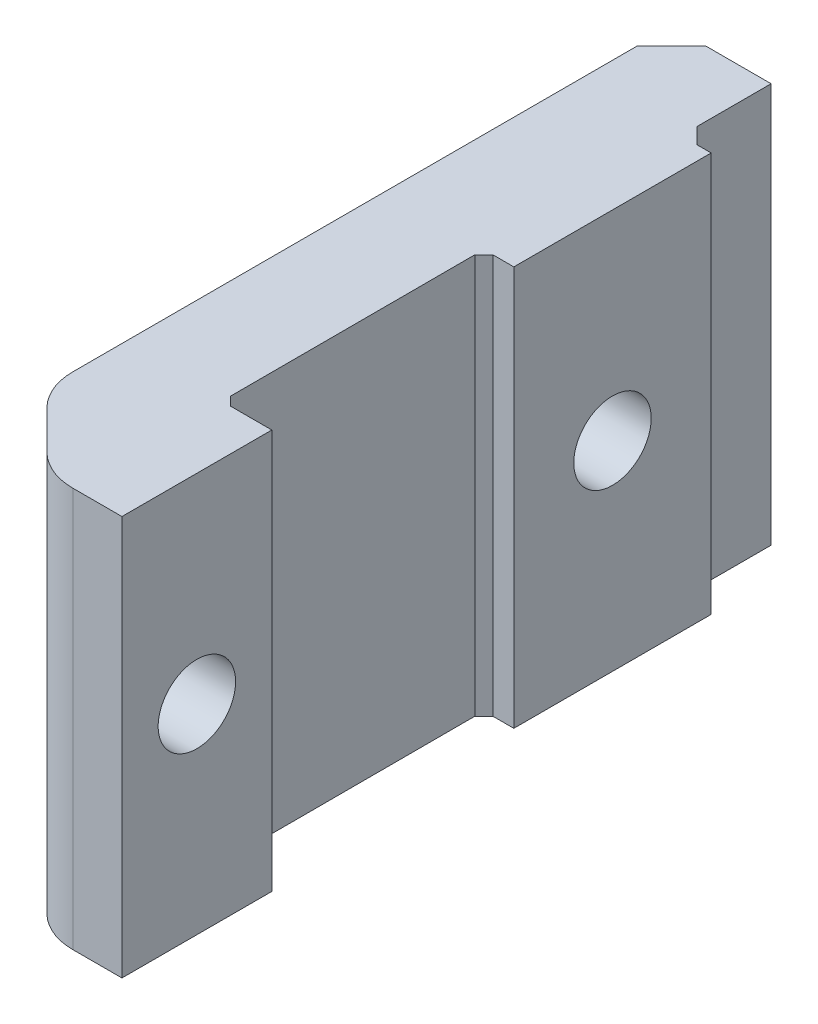
ISO-10303-21;
HEADER;
FILE_DESCRIPTION(('STEP AP214'),'2;1');
FILE_NAME('part.step','',(''),(''),'','','');
FILE_SCHEMA(('AUTOMOTIVE_DESIGN { 1 0 10303 214 1 1 1 1 }'));
ENDSEC;
DATA;
#1=APPLICATION_CONTEXT('core data for automotive mechanical design processes');
#2=APPLICATION_PROTOCOL_DEFINITION('international standard','automotive_design',2000,#1);
#3=PRODUCT_CONTEXT('',#1,'mechanical');
#4=PRODUCT('Part','Part','',(#3));
#5=PRODUCT_RELATED_PRODUCT_CATEGORY('part','',(#4));
#6=PRODUCT_DEFINITION_FORMATION('','',#4);
#7=PRODUCT_DEFINITION_CONTEXT('part definition',#1,'design');
#8=PRODUCT_DEFINITION('design','',#6,#7);
#9=PRODUCT_DEFINITION_SHAPE('','',#8);
#10=(LENGTH_UNIT() NAMED_UNIT(*) SI_UNIT(.MILLI.,.METRE.));
#11=(NAMED_UNIT(*) PLANE_ANGLE_UNIT() SI_UNIT($,.RADIAN.));
#12=(NAMED_UNIT(*) SI_UNIT($,.STERADIAN.) SOLID_ANGLE_UNIT());
#13=UNCERTAINTY_MEASURE_WITH_UNIT(LENGTH_MEASURE(1.E-05),#10,'distance_accuracy_value','');
#14=(GEOMETRIC_REPRESENTATION_CONTEXT(3) GLOBAL_UNCERTAINTY_ASSIGNED_CONTEXT((#13)) GLOBAL_UNIT_ASSIGNED_CONTEXT((#10,
#11,#12)) REPRESENTATION_CONTEXT('',''));
#15=CARTESIAN_POINT('',(0.,0.,0.));
#16=DIRECTION('',(0.,0.,1.));
#17=DIRECTION('',(1.,0.,0.));
#18=AXIS2_PLACEMENT_3D('',#15,#16,#17);
#19=CARTESIAN_POINT('',(-0.17686424474188,16.,3.99697087418199));
#20=DIRECTION('',(0.,-1.,0.));
#21=DIRECTION('',(0.,0.,-1.));
#22=AXIS2_PLACEMENT_3D('',#19,#20,#21);
#23=CYLINDRICAL_SURFACE('',#22,2.5);
#24=CARTESIAN_POINT('',(-2.67686424474188,6.84260296911639,3.99697087418198));
#25=CARTESIAN_POINT('',(-2.67686427610653,6.81660876371672,4.02615143134747));
#26=CARTESIAN_POINT('',(-2.67635253738409,6.79172903577268,4.05630654230294));
#27=CARTESIAN_POINT('',(-2.6741077573834,6.74432875148111,4.11838716476212));
#28=CARTESIAN_POINT('',(-2.67237435533673,6.72180889428229,4.15031319666867));
#29=CARTESIAN_POINT('',(-2.66504878235727,6.65803785912421,4.24840468920199));
#30=CARTESIAN_POINT('',(-2.65733182281447,6.62053670558533,4.31692688150311));
#31=CARTESIAN_POINT('',(-2.63501899545772,6.55648783693852,4.45804592967341));
#32=CARTESIAN_POINT('',(-2.620406159672,6.52996744493575,4.53065244510283));
#33=CARTESIAN_POINT('',(-2.58375461658301,6.48832135402202,4.67708775164324));
#34=CARTESIAN_POINT('',(-2.56173001823432,6.473174180874,4.75091396892161));
#35=CARTESIAN_POINT('',(-2.51094091923655,6.4539541686675,4.89577843485313));
#36=CARTESIAN_POINT('',(-2.48233559362208,6.44964470518506,4.9668422726878));
#37=CARTESIAN_POINT('',(-2.41861781582076,6.4504027173944,5.10622083257924));
#38=CARTESIAN_POINT('',(-2.38348141528112,6.45550534078939,5.17452427276868));
#39=CARTESIAN_POINT('',(-2.31726645703847,6.471496560265,5.29000177431587));
#40=CARTESIAN_POINT('',(-2.28741002219156,6.48059486754875,5.33814981628589));
#41=CARTESIAN_POINT('',(-2.22493832074662,6.50274474602274,5.43173878188784));
#42=CARTESIAN_POINT('',(-2.19232017194963,6.51580048487568,5.47717679085368));
#43=CARTESIAN_POINT('',(-2.1249581848118,6.54519305233081,5.56475980328549));
#44=CARTESIAN_POINT('',(-2.09023105628415,6.56150596302932,5.60692586907717));
#45=CARTESIAN_POINT('',(-2.01882983048771,6.59693105409345,5.68814880419962));
#46=CARTESIAN_POINT('',(-1.9821604062117,6.61603669448427,5.72721261720005));
#47=CARTESIAN_POINT('',(-1.94463119770824,6.63630875431511,5.76473782714836));
#48=B_SPLINE_CURVE_WITH_KNOTS('',3,(#24,#25,#26,#27,#28,#29,#30,#31,#32,#33,#34,#35,#36,#37,#38,
#39,#40,#41,#42,#43,#44,#45,#46,#47),.UNSPECIFIED.,.F.,.F.,(4,2,2,2,2,2,2,2,2,2,2,4),(0.,
0.117176915017423,0.23438844796454,0.468639716091678,0.70347041178757,0.937856591325261,
1.16707906126658,1.39715925375491,1.56903399994687,1.74109038400991,1.91192695332732,
2.08236968567321),.UNSPECIFIED.);
#49=CARTESIAN_POINT('',(-2.67686424474188,6.84260296911639,3.99697087418197));
#50=VERTEX_POINT('',#49);
#51=CARTESIAN_POINT('',(-1.94463119770824,6.63630875431511,5.76473782714836));
#52=VERTEX_POINT('',#51);
#53=EDGE_CURVE('E337',#50,#52,#48,.T.);
#54=ORIENTED_EDGE('',*,*,#53,.F.);
#55=DIRECTION('',(0.,-1.,0.));
#56=VECTOR('',#55,1.);
#57=CARTESIAN_POINT('',(-2.67686424474188,16.,3.99697087418197));
#58=LINE('',#57,#56);
#59=CARTESIAN_POINT('',(-2.67686424474188,0.,3.99697087418197));
#60=VERTEX_POINT('',#59);
#61=EDGE_CURVE('E126',#50,#60,#58,.T.);
#62=ORIENTED_EDGE('',*,*,#61,.T.);
#63=CARTESIAN_POINT('',(-0.17686424474188,0.,3.99697087418199));
#64=DIRECTION('',(0.,1.,0.));
#65=DIRECTION('',(0.,0.,1.));
#66=AXIS2_PLACEMENT_3D('',#63,#64,#65);
#67=CIRCLE('',#66,2.5);
#68=CARTESIAN_POINT('',(-1.94463119770824,0.,5.76473782714836));
#69=VERTEX_POINT('',#68);
#70=EDGE_CURVE('E213',#69,#60,#67,.F.);
#71=ORIENTED_EDGE('',*,*,#70,.F.);
#72=DIRECTION('',(0.,-1.,0.));
#73=VECTOR('',#72,1.);
#74=CARTESIAN_POINT('',(-1.94463119770824,16.,5.76473782714836));
#75=LINE('',#74,#73);
#76=EDGE_CURVE('E319',#52,#69,#75,.T.);
#77=ORIENTED_EDGE('',*,*,#76,.F.);
#78=EDGE_LOOP('',(#54,#62,#71,#77));
#79=FACE_BOUND('',#78,.T.);
#80=ADVANCED_FACE('F40',(#79),#23,.T.);
#81=CARTESIAN_POINT('',(-1.94463119770824,9.36369124568489,5.76473782714836));
#82=CARTESIAN_POINT('',(-1.97935094809745,9.38244521476113,5.7300112206646));
#83=CARTESIAN_POINT('',(-2.0133152429463,9.40019174458247,5.69400457777295));
#84=CARTESIAN_POINT('',(-2.07959052656792,9.433326021924,5.61935779977109));
#85=CARTESIAN_POINT('',(-2.11189864672234,9.44870976316577,5.58071334883852));
#86=CARTESIAN_POINT('',(-2.20641277205655,9.49091425470204,5.46030820682761));
#87=CARTESIAN_POINT('',(-2.26569215890986,9.51350132196357,5.37458546691461));
#88=CARTESIAN_POINT('',(-2.36268184266906,9.5405946471917,5.21317116817058));
#89=CARTESIAN_POINT('',(-2.40231414170283,9.5478836766093,5.13909938422245));
#90=CARTESIAN_POINT('',(-2.47385386079966,9.5513140413007,4.98733881689486));
#91=CARTESIAN_POINT('',(-2.50579211709778,9.54750070556766,4.9096660116194));
#92=CARTESIAN_POINT('',(-2.56146405793244,9.5273795346777,4.75240552432916));
#93=CARTESIAN_POINT('',(-2.58514553208358,9.51099421474825,4.67280894318351));
#94=CARTESIAN_POINT('',(-2.62391794370981,9.46502448491577,4.5151688995399));
#95=CARTESIAN_POINT('',(-2.63899331741983,9.43541633328224,4.43712849565317));
#96=CARTESIAN_POINT('',(-2.65982778733943,9.36813869274231,4.29583541082426));
#97=CARTESIAN_POINT('',(-2.66654412572914,9.33202018545382,4.23198012893864));
#98=CARTESIAN_POINT('',(-2.67293289992067,9.27127654118953,4.14043152415621));
#99=CARTESIAN_POINT('',(-2.674448275939,9.2499399003652,4.11062728996852));
#100=CARTESIAN_POINT('',(-2.67641411208307,9.2051944040917,4.05258584338719));
#101=CARTESIAN_POINT('',(-2.67686472196491,9.18178584053266,4.02434841117323));
#102=CARTESIAN_POINT('',(-2.67686424474188,9.15739703088361,3.99697087418198));
#103=B_SPLINE_CURVE_WITH_KNOTS('',3,(#81,#82,#83,#84,#85,#86,#87,#88,#89,#90,#91,#92,#93,#94,
#95,#96,#97,#98,#99,#100,#101,#102),.UNSPECIFIED.,.F.,.F.,(4,2,2,2,2,2,2,2,2,2,4),(0.,
0.157626717971912,0.315517821017154,0.633616785092805,0.885581558470074,1.13651904870039,
1.38901568709397,1.64196751998635,1.86199341407704,1.9719567481346,2.08190461526373),.UNSPECIFIED.);
#104=CARTESIAN_POINT('',(-1.94463119770824,9.36369124568489,5.76473782714836));
#105=VERTEX_POINT('',#104);
#106=CARTESIAN_POINT('',(-2.67686424474188,9.15739703088361,3.99697087418197));
#107=VERTEX_POINT('',#106);
#108=EDGE_CURVE('E56',#105,#107,#103,.T.);
#109=ORIENTED_EDGE('',*,*,#108,.F.);
#110=CARTESIAN_POINT('',(-1.94463119770824,16.,5.76473782714836));
#111=VERTEX_POINT('',#110);
#112=EDGE_CURVE('E50',#111,#105,#75,.T.);
#113=ORIENTED_EDGE('',*,*,#112,.F.);
#114=CARTESIAN_POINT('',(-0.17686424474188,16.,3.99697087418199));
#115=DIRECTION('',(0.,1.,0.));
#116=DIRECTION('',(0.,0.,1.));
#117=AXIS2_PLACEMENT_3D('',#114,#115,#116);
#118=CIRCLE('',#117,2.5);
#119=CARTESIAN_POINT('',(-2.67686424474188,16.,3.99697087418197));
#120=VERTEX_POINT('',#119);
#121=EDGE_CURVE('E274',#111,#120,#118,.F.);
#122=ORIENTED_EDGE('',*,*,#121,.T.);
#123=EDGE_CURVE('E64',#120,#107,#58,.T.);
#124=ORIENTED_EDGE('',*,*,#123,.T.);
#125=EDGE_LOOP('',(#109,#113,#122,#124));
#126=FACE_BOUND('',#125,.T.);
#127=ADVANCED_FACE('F42',(#126),#23,.T.);
#128=CARTESIAN_POINT('',(-3.8546845124283,16.,3.8546845124283));
#129=DIRECTION('',(0.707106781186547,0.,-0.707106781186548));
#130=DIRECTION('',(-0.707106781186548,0.,-0.707106781186547));
#131=AXIS2_PLACEMENT_3D('',#128,#129,#130);
#132=PLANE('',#131);
#133=ORIENTED_EDGE('',*,*,#112,.T.);
#134=CARTESIAN_POINT('',(-2.68141216003178,8.,5.02795686482482));
#135=DIRECTION('',(0.707106781186547,0.,-0.707106781186548));
#136=DIRECTION('',(0.707106781186548,0.,0.707106781186547));
#137=AXIS2_PLACEMENT_3D('',#134,#135,#136);
#138=ELLIPSE('',#137,2.1920310216783,1.55);
#139=EDGE_CURVE('E329',#105,#52,#138,.T.);
#140=ORIENTED_EDGE('',*,*,#139,.T.);
#141=ORIENTED_EDGE('',*,*,#76,.T.);
#142=DIRECTION('',(0.707106781186548,0.,0.707106781186547));
#143=VECTOR('',#142,1.);
#144=CARTESIAN_POINT('',(-3.8546845124283,0.,3.8546845124283));
#145=LINE('',#144,#143);
#146=CARTESIAN_POINT('',(-0.413645207065423,0.,7.29572381779118));
#147=VERTEX_POINT('',#146);
#148=EDGE_CURVE('E216',#69,#147,#145,.T.);
#149=ORIENTED_EDGE('',*,*,#148,.T.);
#150=DIRECTION('',(0.,-1.,0.));
#151=VECTOR('',#150,1.);
#152=CARTESIAN_POINT('',(-0.413645207065423,16.,7.29572381779118));
#153=LINE('',#152,#151);
#154=CARTESIAN_POINT('',(-0.413645207065423,16.,7.29572381779118));
#155=VERTEX_POINT('',#154);
#156=EDGE_CURVE('E317',#155,#147,#153,.T.);
#157=ORIENTED_EDGE('',*,*,#156,.F.);
#158=DIRECTION('',(0.707106781186548,0.,0.707106781186547));
#159=VECTOR('',#158,1.);
#160=CARTESIAN_POINT('',(-3.8546845124283,16.,3.8546845124283));
#161=LINE('',#160,#159);
#162=EDGE_CURVE('E435',#111,#155,#161,.T.);
#163=ORIENTED_EDGE('',*,*,#162,.F.);
#164=EDGE_LOOP('',(#133,#140,#141,#149,#157,#163));
#165=FACE_BOUND('',#164,.T.);
#166=ADVANCED_FACE('F327',(#165),#132,.F.);
#167=CARTESIAN_POINT('',(1.35412174590095,16.,5.52795686482482));
#168=DIRECTION('',(0.,-1.,0.));
#169=DIRECTION('',(0.,0.,-1.));
#170=AXIS2_PLACEMENT_3D('',#167,#168,#169);
#171=CYLINDRICAL_SURFACE('',#170,2.5);
#172=CARTESIAN_POINT('',(1.35412174590095,0.,5.52795686482482));
#173=DIRECTION('',(0.,1.,0.));
#174=DIRECTION('',(0.,0.,1.));
#175=AXIS2_PLACEMENT_3D('',#172,#173,#174);
#176=CIRCLE('',#175,2.5);
#177=CARTESIAN_POINT('',(1.35412174590096,0.,8.02795686482482));
#178=VERTEX_POINT('',#177);
#179=EDGE_CURVE('E221',#178,#147,#176,.F.);
#180=ORIENTED_EDGE('',*,*,#179,.F.);
#181=DIRECTION('',(0.,-1.,0.));
#182=VECTOR('',#181,1.);
#183=CARTESIAN_POINT('',(1.35412174590096,16.,8.02795686482482));
#184=LINE('',#183,#182);
#185=CARTESIAN_POINT('',(1.35412174590096,16.,8.02795686482482));
#186=VERTEX_POINT('',#185);
#187=EDGE_CURVE('E314',#186,#178,#184,.T.);
#188=ORIENTED_EDGE('',*,*,#187,.F.);
#189=CARTESIAN_POINT('',(1.35412174590095,16.,5.52795686482482));
#190=DIRECTION('',(0.,1.,0.));
#191=DIRECTION('',(0.,0.,1.));
#192=AXIS2_PLACEMENT_3D('',#189,#190,#191);
#193=CIRCLE('',#192,2.5);
#194=EDGE_CURVE('E434',#186,#155,#193,.F.);
#195=ORIENTED_EDGE('',*,*,#194,.T.);
#196=ORIENTED_EDGE('',*,*,#156,.T.);
#197=EDGE_LOOP('',(#180,#188,#195,#196));
#198=FACE_BOUND('',#197,.T.);
#199=ADVANCED_FACE('F345',(#198),#171,.T.);
#200=CARTESIAN_POINT('',(0.,16.,8.02795686482482));
#201=DIRECTION('',(0.,0.,-1.));
#202=DIRECTION('',(-1.,0.,0.));
#203=AXIS2_PLACEMENT_3D('',#200,#201,#202);
#204=PLANE('',#203);
#205=DIRECTION('',(1.,0.,0.));
#206=VECTOR('',#205,1.);
#207=CARTESIAN_POINT('',(0.,0.,8.02795686482482));
#208=LINE('',#207,#206);
#209=CARTESIAN_POINT('',(3.32313575525812,0.,8.02795686482482));
#210=VERTEX_POINT('',#209);
#211=EDGE_CURVE('E225',#178,#210,#208,.T.);
#212=ORIENTED_EDGE('',*,*,#211,.T.);
#213=DIRECTION('',(0.,-1.,0.));
#214=VECTOR('',#213,1.);
#215=CARTESIAN_POINT('',(3.32313575525812,16.,8.02795686482482));
#216=LINE('',#215,#214);
#217=CARTESIAN_POINT('',(3.32313575525812,16.,8.02795686482482));
#218=VERTEX_POINT('',#217);
#219=EDGE_CURVE('E310',#218,#210,#216,.T.);
#220=ORIENTED_EDGE('',*,*,#219,.F.);
#221=DIRECTION('',(1.,0.,0.));
#222=VECTOR('',#221,1.);
#223=CARTESIAN_POINT('',(0.,16.,8.02795686482482));
#224=LINE('',#223,#222);
#225=EDGE_CURVE('E443',#186,#218,#224,.T.);
#226=ORIENTED_EDGE('',*,*,#225,.F.);
#227=ORIENTED_EDGE('',*,*,#187,.T.);
#228=EDGE_LOOP('',(#212,#220,#226,#227));
#229=FACE_BOUND('',#228,.T.);
#230=ADVANCED_FACE('F422',(#229),#204,.F.);
#231=CARTESIAN_POINT('',(3.32313575525812,16.,0.));
#232=DIRECTION('',(-1.,0.,0.));
#233=DIRECTION('',(0.,0.,1.));
#234=AXIS2_PLACEMENT_3D('',#231,#232,#233);
#235=PLANE('',#234);
#236=CARTESIAN_POINT('',(3.32313575525812,8.,5.02795686482482));
#237=DIRECTION('',(1.,0.,0.));
#238=DIRECTION('',(0.,0.,-1.));
#239=AXIS2_PLACEMENT_3D('',#236,#237,#238);
#240=CIRCLE('',#239,1.55);
#241=CARTESIAN_POINT('',(3.32313575525812,8.,3.47795686482482));
#242=VERTEX_POINT('',#241);
#243=EDGE_CURVE('E491',#242,#242,#240,.T.);
#244=ORIENTED_EDGE('',*,*,#243,.F.);
#245=EDGE_LOOP('',(#244));
#246=FACE_BOUND('',#245,.T.);
#247=DIRECTION('',(0.,0.,-1.));
#248=VECTOR('',#247,1.);
#249=CARTESIAN_POINT('',(3.32313575525812,0.,0.));
#250=LINE('',#249,#248);
#251=CARTESIAN_POINT('',(3.32313575525812,0.,2.02795686482482));
#252=VERTEX_POINT('',#251);
#253=EDGE_CURVE('E228',#210,#252,#250,.T.);
#254=ORIENTED_EDGE('',*,*,#253,.T.);
#255=DIRECTION('',(0.,-1.,0.));
#256=VECTOR('',#255,1.);
#257=CARTESIAN_POINT('',(3.32313575525812,16.,2.02795686482482));
#258=LINE('',#257,#256);
#259=CARTESIAN_POINT('',(3.32313575525812,16.,2.02795686482482));
#260=VERTEX_POINT('',#259);
#261=EDGE_CURVE('E306',#260,#252,#258,.T.);
#262=ORIENTED_EDGE('',*,*,#261,.F.);
#263=DIRECTION('',(0.,0.,-1.));
#264=VECTOR('',#263,1.);
#265=CARTESIAN_POINT('',(3.32313575525812,16.,0.));
#266=LINE('',#265,#264);
#267=EDGE_CURVE('E446',#218,#260,#266,.T.);
#268=ORIENTED_EDGE('',*,*,#267,.F.);
#269=ORIENTED_EDGE('',*,*,#219,.T.);
#270=EDGE_LOOP('',(#254,#262,#268,#269));
#271=FACE_BOUND('',#270,.T.);
#272=ADVANCED_FACE('F418',(#246,#271),#235,.F.);
#273=CARTESIAN_POINT('',(0.,16.,2.02795686482482));
#274=DIRECTION('',(0.,0.,1.));
#275=DIRECTION('',(1.,0.,0.));
#276=AXIS2_PLACEMENT_3D('',#273,#274,#275);
#277=PLANE('',#276);
#278=DIRECTION('',(-1.,0.,0.));
#279=VECTOR('',#278,1.);
#280=CARTESIAN_POINT('',(0.,0.,2.02795686482482));
#281=LINE('',#280,#279);
#282=CARTESIAN_POINT('',(1.676155011732,0.,2.02795686482482));
#283=VERTEX_POINT('',#282);
#284=EDGE_CURVE('E231',#252,#283,#281,.T.);
#285=ORIENTED_EDGE('',*,*,#284,.T.);
#286=DIRECTION('',(0.,-1.,0.));
#287=VECTOR('',#286,1.);
#288=CARTESIAN_POINT('',(1.676155011732,16.,2.02795686482482));
#289=LINE('',#288,#287);
#290=CARTESIAN_POINT('',(1.676155011732,16.,2.02795686482482));
#291=VERTEX_POINT('',#290);
#292=EDGE_CURVE('E302',#291,#283,#289,.T.);
#293=ORIENTED_EDGE('',*,*,#292,.F.);
#294=DIRECTION('',(-1.,0.,0.));
#295=VECTOR('',#294,1.);
#296=CARTESIAN_POINT('',(0.,16.,2.02795686482482));
#297=LINE('',#296,#295);
#298=EDGE_CURVE('E449',#260,#291,#297,.T.);
#299=ORIENTED_EDGE('',*,*,#298,.F.);
#300=ORIENTED_EDGE('',*,*,#261,.T.);
#301=EDGE_LOOP('',(#285,#293,#299,#300));
#302=FACE_BOUND('',#301,.T.);
#303=ADVANCED_FACE('F414',(#302),#277,.F.);
#304=CARTESIAN_POINT('',(-0.175900926546408,16.,0.175900926546408));
#305=DIRECTION('',(-0.707106781186547,0.,0.707106781186547));
#306=DIRECTION('',(0.707106781186548,0.,0.707106781186548));
#307=AXIS2_PLACEMENT_3D('',#304,#305,#306);
#308=PLANE('',#307);
#309=DIRECTION('',(-0.707106781186548,0.,-0.707106781186548));
#310=VECTOR('',#309,1.);
#311=CARTESIAN_POINT('',(-0.175900926546408,0.,0.175900926546408));
#312=LINE('',#311,#310);
#313=CARTESIAN_POINT('',(1.32313575525812,0.,1.67493760835094));
#314=VERTEX_POINT('',#313);
#315=EDGE_CURVE('E234',#283,#314,#312,.T.);
#316=ORIENTED_EDGE('',*,*,#315,.T.);
#317=DIRECTION('',(0.,-1.,0.));
#318=VECTOR('',#317,1.);
#319=CARTESIAN_POINT('',(1.32313575525812,16.,1.67493760835094));
#320=LINE('',#319,#318);
#321=CARTESIAN_POINT('',(1.32313575525812,16.,1.67493760835094));
#322=VERTEX_POINT('',#321);
#323=EDGE_CURVE('E299',#322,#314,#320,.T.);
#324=ORIENTED_EDGE('',*,*,#323,.F.);
#325=DIRECTION('',(-0.707106781186548,0.,-0.707106781186548));
#326=VECTOR('',#325,1.);
#327=CARTESIAN_POINT('',(-0.175900926546408,16.,0.175900926546408));
#328=LINE('',#327,#326);
#329=EDGE_CURVE('E452',#291,#322,#328,.T.);
#330=ORIENTED_EDGE('',*,*,#329,.F.);
#331=ORIENTED_EDGE('',*,*,#292,.T.);
#332=EDGE_LOOP('',(#316,#324,#330,#331));
#333=FACE_BOUND('',#332,.T.);
#334=ADVANCED_FACE('F410',(#333),#308,.F.);
#335=CARTESIAN_POINT('',(1.32124815448662,16.,-0.00148768277891311));
#336=DIRECTION('',(0.999999366098944,0.,-0.00112596701143357));
#337=DIRECTION('',(-0.00112596701143357,0.,-0.999999366098944));
#338=AXIS2_PLACEMENT_3D('',#335,#336,#337);
#339=PLANE('',#338);
#340=DIRECTION('',(0.00112596701143357,0.,0.999999366098944));
#341=VECTOR('',#340,1.);
#342=CARTESIAN_POINT('',(1.32124815448662,0.,-0.00148768277891311));
#343=LINE('',#342,#341);
#344=CARTESIAN_POINT('',(1.31212047357365,0.,-8.10800859701682));
#345=VERTEX_POINT('',#344);
#346=EDGE_CURVE('E238',#345,#314,#343,.T.);
#347=ORIENTED_EDGE('',*,*,#346,.F.);
#348=DIRECTION('',(0.,-1.,0.));
#349=VECTOR('',#348,1.);
#350=CARTESIAN_POINT('',(1.31212047357365,16.,-8.10800859701682));
#351=LINE('',#350,#349);
#352=CARTESIAN_POINT('',(1.31212047357365,16.,-8.10800859701682));
#353=VERTEX_POINT('',#352);
#354=EDGE_CURVE('E296',#353,#345,#351,.T.);
#355=ORIENTED_EDGE('',*,*,#354,.F.);
#356=DIRECTION('',(0.00112596701143357,0.,0.999999366098944));
#357=VECTOR('',#356,1.);
#358=CARTESIAN_POINT('',(1.32124815448662,16.,-0.00148768277891311));
#359=LINE('',#358,#357);
#360=EDGE_CURVE('E455',#353,#322,#359,.T.);
#361=ORIENTED_EDGE('',*,*,#360,.T.);
#362=ORIENTED_EDGE('',*,*,#323,.T.);
#363=EDGE_LOOP('',(#347,#355,#361,#362));
#364=FACE_BOUND('',#363,.T.);
#365=ADVANCED_FACE('F406',(#364),#339,.T.);
#366=CARTESIAN_POINT('',(-3.39794406172157,16.,-3.39794406172151));
#367=DIRECTION('',(0.707106781186554,0.,0.707106781186541));
#368=DIRECTION('',(0.707106781186541,0.,-0.707106781186554));
#369=AXIS2_PLACEMENT_3D('',#366,#367,#368);
#370=PLANE('',#369);
#371=DIRECTION('',(-0.707106781186541,0.,0.707106781186554));
#372=VECTOR('',#371,1.);
#373=CARTESIAN_POINT('',(-3.39794406172157,0.,-3.39794406172151));
#374=LINE('',#373,#372);
#375=CARTESIAN_POINT('',(1.676155011732,0.,-8.47204313517518));
#376=VERTEX_POINT('',#375);
#377=EDGE_CURVE('E242',#376,#345,#374,.T.);
#378=ORIENTED_EDGE('',*,*,#377,.F.);
#379=DIRECTION('',(0.,-1.,0.));
#380=VECTOR('',#379,1.);
#381=CARTESIAN_POINT('',(1.676155011732,16.,-8.47204313517518));
#382=LINE('',#381,#380);
#383=CARTESIAN_POINT('',(1.676155011732,16.,-8.47204313517518));
#384=VERTEX_POINT('',#383);
#385=EDGE_CURVE('E293',#384,#376,#382,.T.);
#386=ORIENTED_EDGE('',*,*,#385,.F.);
#387=DIRECTION('',(-0.707106781186541,0.,0.707106781186554));
#388=VECTOR('',#387,1.);
#389=CARTESIAN_POINT('',(-3.39794406172157,16.,-3.39794406172151));
#390=LINE('',#389,#388);
#391=EDGE_CURVE('E459',#384,#353,#390,.T.);
#392=ORIENTED_EDGE('',*,*,#391,.T.);
#393=ORIENTED_EDGE('',*,*,#354,.T.);
#394=EDGE_LOOP('',(#378,#386,#392,#393));
#395=FACE_BOUND('',#394,.T.);
#396=ADVANCED_FACE('F402',(#395),#370,.T.);
#397=CARTESIAN_POINT('',(0.,16.,-8.47204313517518));
#398=DIRECTION('',(0.,0.,1.));
#399=DIRECTION('',(1.,0.,0.));
#400=AXIS2_PLACEMENT_3D('',#397,#398,#399);
#401=PLANE('',#400);
#402=DIRECTION('',(-1.,0.,0.));
#403=VECTOR('',#402,1.);
#404=CARTESIAN_POINT('',(0.,0.,-8.47204313517518));
#405=LINE('',#404,#403);
#406=CARTESIAN_POINT('',(2.51212047357365,0.,-8.47204313517518));
#407=VERTEX_POINT('',#406);
#408=EDGE_CURVE('E246',#407,#376,#405,.T.);
#409=ORIENTED_EDGE('',*,*,#408,.F.);
#410=DIRECTION('',(0.,-1.,0.));
#411=VECTOR('',#410,1.);
#412=CARTESIAN_POINT('',(2.51212047357365,16.,-8.47204313517518));
#413=LINE('',#412,#411);
#414=CARTESIAN_POINT('',(2.51212047357365,16.,-8.47204313517518));
#415=VERTEX_POINT('',#414);
#416=EDGE_CURVE('E290',#415,#407,#413,.T.);
#417=ORIENTED_EDGE('',*,*,#416,.F.);
#418=DIRECTION('',(-1.,0.,0.));
#419=VECTOR('',#418,1.);
#420=CARTESIAN_POINT('',(0.,16.,-8.47204313517518));
#421=LINE('',#420,#419);
#422=EDGE_CURVE('E463',#415,#384,#421,.T.);
#423=ORIENTED_EDGE('',*,*,#422,.T.);
#424=ORIENTED_EDGE('',*,*,#385,.T.);
#425=EDGE_LOOP('',(#409,#417,#423,#424));
#426=FACE_BOUND('',#425,.T.);
#427=ADVANCED_FACE('F398',(#426),#401,.T.);
#428=CARTESIAN_POINT('',(2.51212047357365,16.,0.));
#429=DIRECTION('',(-1.,0.,0.));
#430=DIRECTION('',(0.,0.,1.));
#431=AXIS2_PLACEMENT_3D('',#428,#429,#430);
#432=PLANE('',#431);
#433=CARTESIAN_POINT('',(2.51212047357365,8.,-12.4220431351752));
#434=DIRECTION('',(-1.,0.,0.));
#435=DIRECTION('',(0.,0.,1.));
#436=AXIS2_PLACEMENT_3D('',#433,#434,#435);
#437=CIRCLE('',#436,1.55);
#438=CARTESIAN_POINT('',(2.51212047357365,8.,-10.8720431351752));
#439=VERTEX_POINT('',#438);
#440=EDGE_CURVE('E217',#439,#439,#437,.T.);
#441=ORIENTED_EDGE('',*,*,#440,.T.);
#442=EDGE_LOOP('',(#441));
#443=FACE_BOUND('',#442,.T.);
#444=DIRECTION('',(0.,0.,-1.));
#445=VECTOR('',#444,1.);
#446=CARTESIAN_POINT('',(2.51212047357365,0.,0.));
#447=LINE('',#446,#445);
#448=CARTESIAN_POINT('',(2.51212047357365,0.,-16.3720431351752));
#449=VERTEX_POINT('',#448);
#450=EDGE_CURVE('E250',#407,#449,#447,.T.);
#451=ORIENTED_EDGE('',*,*,#450,.T.);
#452=DIRECTION('',(0.,-1.,0.));
#453=VECTOR('',#452,1.);
#454=CARTESIAN_POINT('',(2.51212047357365,16.,-16.3720431351752));
#455=LINE('',#454,#453);
#456=CARTESIAN_POINT('',(2.51212047357365,16.,-16.3720431351752));
#457=VERTEX_POINT('',#456);
#458=EDGE_CURVE('E287',#457,#449,#455,.T.);
#459=ORIENTED_EDGE('',*,*,#458,.F.);
#460=DIRECTION('',(0.,0.,-1.));
#461=VECTOR('',#460,1.);
#462=CARTESIAN_POINT('',(2.51212047357365,16.,0.));
#463=LINE('',#462,#461);
#464=EDGE_CURVE('E467',#415,#457,#463,.T.);
#465=ORIENTED_EDGE('',*,*,#464,.F.);
#466=ORIENTED_EDGE('',*,*,#416,.T.);
#467=EDGE_LOOP('',(#451,#459,#465,#466));
#468=FACE_BOUND('',#467,.T.);
#469=ADVANCED_FACE('F394',(#443,#468),#432,.F.);
#470=CARTESIAN_POINT('',(0.,16.,-16.3720431351752));
#471=DIRECTION('',(0.,0.,-1.));
#472=DIRECTION('',(-1.,0.,0.));
#473=AXIS2_PLACEMENT_3D('',#470,#471,#472);
#474=PLANE('',#473);
#475=DIRECTION('',(1.,0.,0.));
#476=VECTOR('',#475,1.);
#477=CARTESIAN_POINT('',(0.,0.,-16.3720431351752));
#478=LINE('',#477,#476);
#479=CARTESIAN_POINT('',(1.93694176865813,0.,-16.3720431351752));
#480=VERTEX_POINT('',#479);
#481=EDGE_CURVE('E254',#480,#449,#478,.T.);
#482=ORIENTED_EDGE('',*,*,#481,.F.);
#483=DIRECTION('',(0.,-1.,0.));
#484=VECTOR('',#483,1.);
#485=CARTESIAN_POINT('',(1.93694176865813,16.,-16.3720431351752));
#486=LINE('',#485,#484);
#487=CARTESIAN_POINT('',(1.93694176865813,16.,-16.3720431351752));
#488=VERTEX_POINT('',#487);
#489=EDGE_CURVE('E284',#488,#480,#486,.T.);
#490=ORIENTED_EDGE('',*,*,#489,.F.);
#491=DIRECTION('',(1.,0.,0.));
#492=VECTOR('',#491,1.);
#493=CARTESIAN_POINT('',(0.,16.,-16.3720431351752));
#494=LINE('',#493,#492);
#495=EDGE_CURVE('E470',#488,#457,#494,.T.);
#496=ORIENTED_EDGE('',*,*,#495,.T.);
#497=ORIENTED_EDGE('',*,*,#458,.T.);
#498=EDGE_LOOP('',(#482,#490,#496,#497));
#499=FACE_BOUND('',#498,.T.);
#500=ADVANCED_FACE('F390',(#499),#474,.T.);
#501=CARTESIAN_POINT('',(9.15449245191665,16.,-9.15449245191666));
#502=DIRECTION('',(0.707106781186547,0.,-0.707106781186548));
#503=DIRECTION('',(-0.707106781186548,0.,-0.707106781186547));
#504=AXIS2_PLACEMENT_3D('',#501,#502,#503);
#505=PLANE('',#504);
#506=DIRECTION('',(0.707106781186548,0.,0.707106781186547));
#507=VECTOR('',#506,1.);
#508=CARTESIAN_POINT('',(9.15449245191665,0.,-9.15449245191666));
#509=LINE('',#508,#507);
#510=CARTESIAN_POINT('',(1.31212047357365,0.,-16.9968644302597));
#511=VERTEX_POINT('',#510);
#512=EDGE_CURVE('E258',#511,#480,#509,.T.);
#513=ORIENTED_EDGE('',*,*,#512,.F.);
#514=DIRECTION('',(0.,-1.,0.));
#515=VECTOR('',#514,1.);
#516=CARTESIAN_POINT('',(1.31212047357365,16.,-16.9968644302597));
#517=LINE('',#516,#515);
#518=CARTESIAN_POINT('',(1.31212047357365,16.,-16.9968644302597));
#519=VERTEX_POINT('',#518);
#520=EDGE_CURVE('E281',#519,#511,#517,.T.);
#521=ORIENTED_EDGE('',*,*,#520,.F.);
#522=DIRECTION('',(0.707106781186548,0.,0.707106781186547));
#523=VECTOR('',#522,1.);
#524=CARTESIAN_POINT('',(9.15449245191665,16.,-9.15449245191666));
#525=LINE('',#524,#523);
#526=EDGE_CURVE('E474',#519,#488,#525,.T.);
#527=ORIENTED_EDGE('',*,*,#526,.T.);
#528=ORIENTED_EDGE('',*,*,#489,.T.);
#529=EDGE_LOOP('',(#513,#521,#527,#528));
#530=FACE_BOUND('',#529,.T.);
#531=ADVANCED_FACE('F386',(#530),#505,.T.);
#532=CARTESIAN_POINT('',(1.31212047357365,16.,0.));
#533=DIRECTION('',(-1.,0.,0.));
#534=DIRECTION('',(0.,0.,1.));
#535=AXIS2_PLACEMENT_3D('',#532,#533,#534);
#536=PLANE('',#535);
#537=DIRECTION('',(0.,0.,-1.));
#538=VECTOR('',#537,1.);
#539=CARTESIAN_POINT('',(1.31212047357365,0.,0.));
#540=LINE('',#539,#538);
#541=CARTESIAN_POINT('',(1.31212047357365,0.,-19.9720431351752));
#542=VERTEX_POINT('',#541);
#543=EDGE_CURVE('E262',#511,#542,#540,.T.);
#544=ORIENTED_EDGE('',*,*,#543,.T.);
#545=DIRECTION('',(0.,-1.,0.));
#546=VECTOR('',#545,1.);
#547=CARTESIAN_POINT('',(1.31212047357365,16.,-19.9720431351752));
#548=LINE('',#547,#546);
#549=CARTESIAN_POINT('',(1.31212047357365,16.,-19.9720431351752));
#550=VERTEX_POINT('',#549);
#551=EDGE_CURVE('E202',#550,#542,#548,.T.);
#552=ORIENTED_EDGE('',*,*,#551,.F.);
#553=DIRECTION('',(0.,0.,-1.));
#554=VECTOR('',#553,1.);
#555=CARTESIAN_POINT('',(1.31212047357365,16.,0.));
#556=LINE('',#555,#554);
#557=EDGE_CURVE('E187',#519,#550,#556,.T.);
#558=ORIENTED_EDGE('',*,*,#557,.F.);
#559=ORIENTED_EDGE('',*,*,#520,.T.);
#560=EDGE_LOOP('',(#544,#552,#558,#559));
#561=FACE_BOUND('',#560,.T.);
#562=ADVANCED_FACE('F383',(#561),#536,.F.);
#563=CARTESIAN_POINT('',(0.,16.,-19.9720431351752));
#564=DIRECTION('',(0.,0.,1.));
#565=DIRECTION('',(1.,0.,0.));
#566=AXIS2_PLACEMENT_3D('',#563,#564,#565);
#567=PLANE('',#566);
#568=DIRECTION('',(-1.,0.,0.));
#569=VECTOR('',#568,1.);
#570=CARTESIAN_POINT('',(0.,0.,-19.9720431351752));
#571=LINE('',#570,#569);
#572=CARTESIAN_POINT('',(-1.30388520522876,0.,-19.9720431351752));
#573=VERTEX_POINT('',#572);
#574=EDGE_CURVE('E197',#542,#573,#571,.T.);
#575=ORIENTED_EDGE('',*,*,#574,.T.);
#576=DIRECTION('',(0.,-1.,0.));
#577=VECTOR('',#576,1.);
#578=CARTESIAN_POINT('',(-1.30388520522876,16.,-19.9720431351752));
#579=LINE('',#578,#577);
#580=CARTESIAN_POINT('',(-1.30388520522876,16.,-19.9720431351752));
#581=VERTEX_POINT('',#580);
#582=EDGE_CURVE('E194',#581,#573,#579,.T.);
#583=ORIENTED_EDGE('',*,*,#582,.F.);
#584=DIRECTION('',(-1.,0.,0.));
#585=VECTOR('',#584,1.);
#586=CARTESIAN_POINT('',(0.,16.,-19.9720431351752));
#587=LINE('',#586,#585);
#588=EDGE_CURVE('E178',#550,#581,#587,.T.);
#589=ORIENTED_EDGE('',*,*,#588,.F.);
#590=ORIENTED_EDGE('',*,*,#551,.T.);
#591=EDGE_LOOP('',(#575,#583,#589,#590));
#592=FACE_BOUND('',#591,.T.);
#593=ADVANCED_FACE('F195',(#592),#567,.F.);
#594=CARTESIAN_POINT('',(-10.637964170202,16.,-10.637964170202));
#595=DIRECTION('',(-0.707106781186547,0.,-0.707106781186548));
#596=DIRECTION('',(-0.707106781186548,0.,0.707106781186547));
#597=AXIS2_PLACEMENT_3D('',#594,#595,#596);
#598=PLANE('',#597);
#599=DIRECTION('',(0.707106781186548,0.,-0.707106781186547));
#600=VECTOR('',#599,1.);
#601=CARTESIAN_POINT('',(-10.637964170202,0.,-10.637964170202));
#602=LINE('',#601,#600);
#603=CARTESIAN_POINT('',(-2.67686424474188,0.,-18.5990640956621));
#604=VERTEX_POINT('',#603);
#605=EDGE_CURVE('E267',#604,#573,#602,.T.);
#606=ORIENTED_EDGE('',*,*,#605,.F.);
#607=DIRECTION('',(0.,-1.,0.));
#608=VECTOR('',#607,1.);
#609=CARTESIAN_POINT('',(-2.67686424474188,16.,-18.5990640956621));
#610=LINE('',#609,#608);
#611=CARTESIAN_POINT('',(-2.67686424474188,16.,-18.5990640956621));
#612=VERTEX_POINT('',#611);
#613=EDGE_CURVE('E203',#612,#604,#610,.T.);
#614=ORIENTED_EDGE('',*,*,#613,.F.);
#615=DIRECTION('',(0.707106781186548,0.,-0.707106781186547));
#616=VECTOR('',#615,1.);
#617=CARTESIAN_POINT('',(-10.637964170202,16.,-10.637964170202));
#618=LINE('',#617,#616);
#619=EDGE_CURVE('E184',#612,#581,#618,.T.);
#620=ORIENTED_EDGE('',*,*,#619,.T.);
#621=ORIENTED_EDGE('',*,*,#582,.T.);
#622=EDGE_LOOP('',(#606,#614,#620,#621));
#623=FACE_BOUND('',#622,.T.);
#624=ADVANCED_FACE('F205',(#623),#598,.T.);
#625=CARTESIAN_POINT('',(-2.67686424474188,16.,0.));
#626=DIRECTION('',(-1.,0.,0.));
#627=DIRECTION('',(0.,0.,1.));
#628=AXIS2_PLACEMENT_3D('',#625,#626,#627);
#629=PLANE('',#628);
#630=CARTESIAN_POINT('',(-2.67686424474188,8.,-12.4220431351752));
#631=DIRECTION('',(1.,0.,0.));
#632=DIRECTION('',(0.,0.,-1.));
#633=AXIS2_PLACEMENT_3D('',#630,#631,#632);
#634=CIRCLE('',#633,1.55);
#635=CARTESIAN_POINT('',(-2.67686424474188,8.,-13.9720431351752));
#636=VERTEX_POINT('',#635);
#637=EDGE_CURVE('E351',#636,#636,#634,.T.);
#638=ORIENTED_EDGE('',*,*,#637,.T.);
#639=EDGE_LOOP('',(#638));
#640=FACE_BOUND('',#639,.T.);
#641=CARTESIAN_POINT('',(-2.67686424474188,8.,5.02795686482482));
#642=DIRECTION('',(-1.,0.,0.));
#643=DIRECTION('',(0.,0.,1.));
#644=AXIS2_PLACEMENT_3D('',#641,#642,#643);
#645=CIRCLE('',#644,1.55);
#646=EDGE_CURVE('E11',#107,#50,#645,.T.);
#647=ORIENTED_EDGE('',*,*,#646,.F.);
#648=ORIENTED_EDGE('',*,*,#123,.F.);
#649=DIRECTION('',(0.,0.,-1.));
#650=VECTOR('',#649,1.);
#651=CARTESIAN_POINT('',(-2.67686424474188,16.,0.));
#652=LINE('',#651,#650);
#653=EDGE_CURVE('E207',#120,#612,#652,.T.);
#654=ORIENTED_EDGE('',*,*,#653,.T.);
#655=ORIENTED_EDGE('',*,*,#613,.T.);
#656=DIRECTION('',(0.,0.,-1.));
#657=VECTOR('',#656,1.);
#658=CARTESIAN_POINT('',(-2.67686424474188,0.,0.));
#659=LINE('',#658,#657);
#660=EDGE_CURVE('E270',#60,#604,#659,.T.);
#661=ORIENTED_EDGE('',*,*,#660,.F.);
#662=ORIENTED_EDGE('',*,*,#61,.F.);
#663=EDGE_LOOP('',(#647,#648,#654,#655,#661,#662));
#664=FACE_BOUND('',#663,.T.);
#665=ADVANCED_FACE('F373',(#640,#664),#629,.T.);
#666=CARTESIAN_POINT('',(0.,16.,0.));
#667=DIRECTION('',(0.,1.,0.));
#668=DIRECTION('',(0.,0.,1.));
#669=AXIS2_PLACEMENT_3D('',#666,#667,#668);
#670=PLANE('',#669);
#671=ORIENTED_EDGE('',*,*,#121,.F.);
#672=ORIENTED_EDGE('',*,*,#162,.T.);
#673=ORIENTED_EDGE('',*,*,#194,.F.);
#674=ORIENTED_EDGE('',*,*,#225,.T.);
#675=ORIENTED_EDGE('',*,*,#267,.T.);
#676=ORIENTED_EDGE('',*,*,#298,.T.);
#677=ORIENTED_EDGE('',*,*,#329,.T.);
#678=ORIENTED_EDGE('',*,*,#360,.F.);
#679=ORIENTED_EDGE('',*,*,#391,.F.);
#680=ORIENTED_EDGE('',*,*,#422,.F.);
#681=ORIENTED_EDGE('',*,*,#464,.T.);
#682=ORIENTED_EDGE('',*,*,#495,.F.);
#683=ORIENTED_EDGE('',*,*,#526,.F.);
#684=ORIENTED_EDGE('',*,*,#557,.T.);
#685=ORIENTED_EDGE('',*,*,#588,.T.);
#686=ORIENTED_EDGE('',*,*,#619,.F.);
#687=ORIENTED_EDGE('',*,*,#653,.F.);
#688=EDGE_LOOP('',(#671,#672,#673,#674,#675,#676,#677,#678,#679,#680,#681,#682,#683,#684,#685,
#686,#687));
#689=FACE_BOUND('',#688,.T.);
#690=ADVANCED_FACE('F181',(#689),#670,.T.);
#691=CARTESIAN_POINT('',(0.,0.,0.));
#692=DIRECTION('',(0.,1.,0.));
#693=DIRECTION('',(0.,0.,1.));
#694=AXIS2_PLACEMENT_3D('',#691,#692,#693);
#695=PLANE('',#694);
#696=ORIENTED_EDGE('',*,*,#70,.T.);
#697=ORIENTED_EDGE('',*,*,#660,.T.);
#698=ORIENTED_EDGE('',*,*,#605,.T.);
#699=ORIENTED_EDGE('',*,*,#574,.F.);
#700=ORIENTED_EDGE('',*,*,#543,.F.);
#701=ORIENTED_EDGE('',*,*,#512,.T.);
#702=ORIENTED_EDGE('',*,*,#481,.T.);
#703=ORIENTED_EDGE('',*,*,#450,.F.);
#704=ORIENTED_EDGE('',*,*,#408,.T.);
#705=ORIENTED_EDGE('',*,*,#377,.T.);
#706=ORIENTED_EDGE('',*,*,#346,.T.);
#707=ORIENTED_EDGE('',*,*,#315,.F.);
#708=ORIENTED_EDGE('',*,*,#284,.F.);
#709=ORIENTED_EDGE('',*,*,#253,.F.);
#710=ORIENTED_EDGE('',*,*,#211,.F.);
#711=ORIENTED_EDGE('',*,*,#179,.T.);
#712=ORIENTED_EDGE('',*,*,#148,.F.);
#713=EDGE_LOOP('',(#696,#697,#698,#699,#700,#701,#702,#703,#704,#705,#706,#707,#708,#709,#710,
#711,#712));
#714=FACE_BOUND('',#713,.T.);
#715=ADVANCED_FACE('F331',(#714),#695,.F.);
#716=CARTESIAN_POINT('',(-2.67686424474188,8.,5.02795686482482));
#717=DIRECTION('',(1.,0.,0.));
#718=DIRECTION('',(0.,0.,-1.));
#719=AXIS2_PLACEMENT_3D('',#716,#717,#718);
#720=CYLINDRICAL_SURFACE('',#719,1.55);
#721=ORIENTED_EDGE('',*,*,#53,.T.);
#722=ORIENTED_EDGE('',*,*,#139,.F.);
#723=ORIENTED_EDGE('',*,*,#108,.T.);
#724=ORIENTED_EDGE('',*,*,#646,.T.);
#725=EDGE_LOOP('',(#721,#722,#723,#724));
#726=FACE_BOUND('',#725,.T.);
#727=ORIENTED_EDGE('',*,*,#243,.T.);
#728=EDGE_LOOP('',(#727));
#729=FACE_BOUND('',#728,.T.);
#730=ADVANCED_FACE('F364',(#726,#729),#720,.F.);
#731=CARTESIAN_POINT('',(-2.67686424474188,8.,-12.4220431351752));
#732=DIRECTION('',(1.,0.,0.));
#733=DIRECTION('',(0.,0.,-1.));
#734=AXIS2_PLACEMENT_3D('',#731,#732,#733);
#735=CYLINDRICAL_SURFACE('',#734,1.55);
#736=ORIENTED_EDGE('',*,*,#637,.F.);
#737=EDGE_LOOP('',(#736));
#738=FACE_BOUND('',#737,.T.);
#739=ORIENTED_EDGE('',*,*,#440,.F.);
#740=EDGE_LOOP('',(#739));
#741=FACE_BOUND('',#740,.T.);
#742=ADVANCED_FACE('F369',(#738,#741),#735,.F.);
#743=CLOSED_SHELL('',(#80,#127,#166,#199,#230,#272,#303,#334,#365,#396,#427,#469,#500,#531,#562,
#593,#624,#665,#690,#715,#730,#742));
#744=MANIFOLD_SOLID_BREP('B2',#743);
#745=ADVANCED_BREP_SHAPE_REPRESENTATION('',(#18,#744),#14);
#746=SHAPE_DEFINITION_REPRESENTATION(#9,#745);
ENDSEC;
END-ISO-10303-21;
